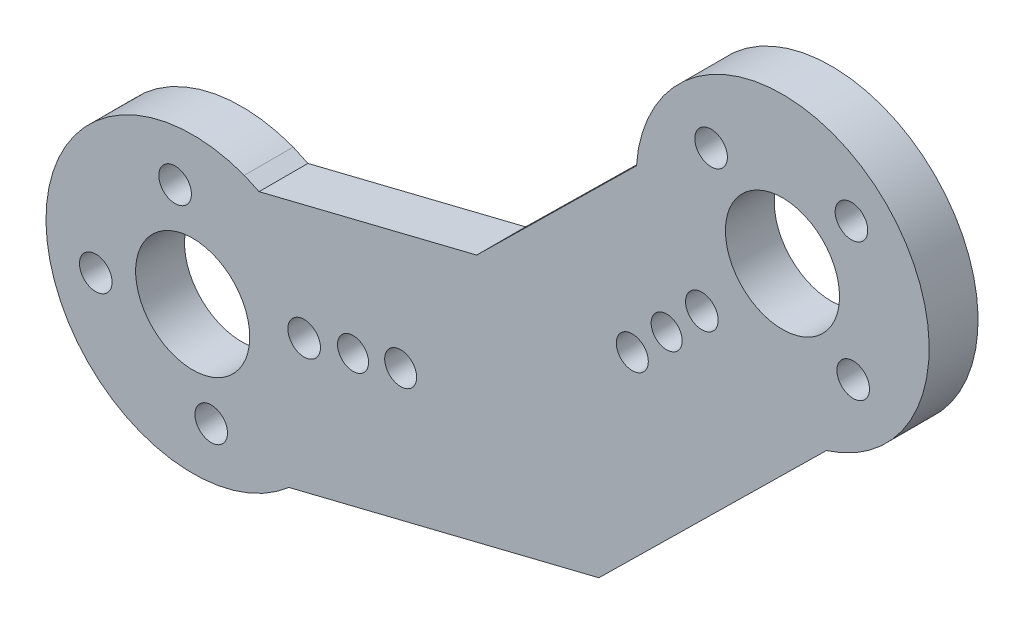
ISO-10303-21;
HEADER;
FILE_DESCRIPTION(('STEP AP214'),'2;1');
FILE_NAME('part.step','',(''),(''),'','','');
FILE_SCHEMA(('AUTOMOTIVE_DESIGN { 1 0 10303 214 1 1 1 1 }'));
ENDSEC;
DATA;
#1=APPLICATION_CONTEXT('core data for automotive mechanical design processes');
#2=APPLICATION_PROTOCOL_DEFINITION('international standard','automotive_design',2000,#1);
#3=PRODUCT_CONTEXT('',#1,'mechanical');
#4=PRODUCT('Part','Part','',(#3));
#5=PRODUCT_RELATED_PRODUCT_CATEGORY('part','',(#4));
#6=PRODUCT_DEFINITION_FORMATION('','',#4);
#7=PRODUCT_DEFINITION_CONTEXT('part definition',#1,'design');
#8=PRODUCT_DEFINITION('design','',#6,#7);
#9=PRODUCT_DEFINITION_SHAPE('','',#8);
#10=(LENGTH_UNIT() NAMED_UNIT(*) SI_UNIT(.MILLI.,.METRE.));
#11=(NAMED_UNIT(*) PLANE_ANGLE_UNIT() SI_UNIT($,.RADIAN.));
#12=(NAMED_UNIT(*) SI_UNIT($,.STERADIAN.) SOLID_ANGLE_UNIT());
#13=UNCERTAINTY_MEASURE_WITH_UNIT(LENGTH_MEASURE(1.E-05),#10,'distance_accuracy_value','');
#14=(GEOMETRIC_REPRESENTATION_CONTEXT(3) GLOBAL_UNCERTAINTY_ASSIGNED_CONTEXT((#13)) GLOBAL_UNIT_ASSIGNED_CONTEXT((#10,
#11,#12)) REPRESENTATION_CONTEXT('',''));
#15=CARTESIAN_POINT('',(0.,0.,0.));
#16=DIRECTION('',(0.,0.,1.));
#17=DIRECTION('',(1.,0.,0.));
#18=AXIS2_PLACEMENT_3D('',#15,#16,#17);
#19=CARTESIAN_POINT('',(-67.5141909041783,8.93081838338803,3.));
#20=DIRECTION('',(0.,0.,1.));
#21=DIRECTION('',(1.,0.,0.));
#22=AXIS2_PLACEMENT_3D('',#19,#20,#21);
#23=PLANE('',#22);
#24=CARTESIAN_POINT('',(-73.4605280592639,7.61583760860506,3.));
#25=DIRECTION('',(0.,0.,1.));
#26=DIRECTION('',(-1.,0.,0.));
#27=AXIS2_PLACEMENT_3D('',#24,#25,#26);
#28=CIRCLE('',#27,0.999999999999994);
#29=CARTESIAN_POINT('',(-74.4605280592638,7.61583760860506,3.));
#30=VERTEX_POINT('',#29);
#31=EDGE_CURVE('E247',#30,#30,#28,.T.);
#32=ORIENTED_EDGE('',*,*,#31,.F.);
#33=EDGE_LOOP('',(#32));
#34=FACE_BOUND('',#33,.T.);
#35=CARTESIAN_POINT('',(-26.9918209162552,25.1757246238808,3.));
#36=DIRECTION('',(0.,0.,1.));
#37=DIRECTION('',(-1.,0.,0.));
#38=AXIS2_PLACEMENT_3D('',#35,#36,#37);
#39=CIRCLE('',#38,0.999999999999997);
#40=CARTESIAN_POINT('',(-27.9918209162552,25.1757246238808,3.));
#41=VERTEX_POINT('',#40);
#42=EDGE_CURVE('E235',#41,#41,#39,.T.);
#43=ORIENTED_EDGE('',*,*,#42,.F.);
#44=EDGE_LOOP('',(#43));
#45=FACE_BOUND('',#44,.T.);
#46=CARTESIAN_POINT('',(-38.4361472781531,21.9913590622129,3.));
#47=DIRECTION('',(0.,0.,1.));
#48=DIRECTION('',(-1.,0.,0.));
#49=AXIS2_PLACEMENT_3D('',#46,#47,#48);
#50=CIRCLE('',#49,0.952573724330306);
#51=CARTESIAN_POINT('',(-39.3887210024834,21.9913590622129,3.));
#52=VERTEX_POINT('',#51);
#53=EDGE_CURVE('E223',#52,#52,#50,.T.);
#54=ORIENTED_EDGE('',*,*,#53,.F.);
#55=EDGE_LOOP('',(#54));
#56=FACE_BOUND('',#55,.T.);
#57=CARTESIAN_POINT('',(-57.6757808668012,11.2277455860194,3.));
#58=DIRECTION('',(0.,0.,1.));
#59=DIRECTION('',(1.,0.,0.));
#60=AXIS2_PLACEMENT_3D('',#57,#58,#59);
#61=CIRCLE('',#60,0.952573724330311);
#62=CARTESIAN_POINT('',(-56.7232071424709,11.2277455860194,3.));
#63=VERTEX_POINT('',#62);
#64=EDGE_CURVE('E211',#63,#63,#61,.T.);
#65=ORIENTED_EDGE('',*,*,#64,.F.);
#66=EDGE_LOOP('',(#65));
#67=FACE_BOUND('',#66,.T.);
#68=CARTESIAN_POINT('',(-40.5435103071916,19.856172638539,3.));
#69=DIRECTION('',(0.,0.,1.));
#70=DIRECTION('',(-1.,0.,0.));
#71=AXIS2_PLACEMENT_3D('',#68,#69,#70);
#72=CIRCLE('',#71,0.980307260569642);
#73=CARTESIAN_POINT('',(-41.5238175677613,19.856172638539,3.));
#74=VERTEX_POINT('',#73);
#75=EDGE_CURVE('E199',#74,#74,#72,.T.);
#76=ORIENTED_EDGE('',*,*,#75,.F.);
#77=EDGE_LOOP('',(#76));
#78=FACE_BOUND('',#77,.T.);
#79=CARTESIAN_POINT('',(-60.6757808668012,10.5359051160979,3.));
#80=DIRECTION('',(0.,0.,1.));
#81=DIRECTION('',(1.,0.,0.));
#82=AXIS2_PLACEMENT_3D('',#79,#80,#81);
#83=CIRCLE('',#82,0.999999999999998);
#84=CARTESIAN_POINT('',(-59.6757808668012,10.5359051160979,3.));
#85=VERTEX_POINT('',#84);
#86=EDGE_CURVE('E187',#85,#85,#83,.T.);
#87=ORIENTED_EDGE('',*,*,#86,.F.);
#88=EDGE_LOOP('',(#87));
#89=FACE_BOUND('',#88,.T.);
#90=CARTESIAN_POINT('',(-27.0988202811822,33.552896145621,3.));
#91=DIRECTION('',(0.,0.,1.));
#92=DIRECTION('',(1.,0.,0.));
#93=AXIS2_PLACEMENT_3D('',#90,#91,#92);
#94=CIRCLE('',#93,1.);
#95=CARTESIAN_POINT('',(-26.0988202811822,33.552896145621,3.));
#96=VERTEX_POINT('',#95);
#97=EDGE_CURVE('E133',#96,#96,#94,.T.);
#98=ORIENTED_EDGE('',*,*,#97,.F.);
#99=EDGE_LOOP('',(#98));
#100=FACE_BOUND('',#99,.T.);
#101=CARTESIAN_POINT('',(-67.5141909041783,8.93081838338803,3.));
#102=DIRECTION('',(0.,0.,1.));
#103=DIRECTION('',(1.,0.,0.));
#104=AXIS2_PLACEMENT_3D('',#101,#102,#103);
#105=CIRCLE('',#104,9.00000000000001);
#106=CARTESIAN_POINT('',(-64.3481560706339,17.355557158732,3.));
#107=VERTEX_POINT('',#106);
#108=CARTESIAN_POINT('',(-61.6083117668075,2.1396040873458,3.));
#109=VERTEX_POINT('',#108);
#110=EDGE_CURVE('E144',#107,#109,#105,.T.);
#111=ORIENTED_EDGE('',*,*,#110,.T.);
#112=DIRECTION('',(0.970680870853682,0.240371893029818,0.));
#113=VECTOR('',#112,1.);
#114=CARTESIAN_POINT('',(-42.594837437472,6.84795361276374,3.));
#115=LINE('',#114,#113);
#116=CARTESIAN_POINT('',(-42.594837437472,6.84795361276374,3.));
#117=VERTEX_POINT('',#116);
#118=EDGE_CURVE('E92',#109,#117,#115,.T.);
#119=ORIENTED_EDGE('',*,*,#118,.T.);
#120=DIRECTION('',(0.71274658117523,0.701421635696406,0.));
#121=VECTOR('',#120,1.);
#122=CARTESIAN_POINT('',(-42.594837437472,6.84795361276374,3.));
#123=LINE('',#122,#121);
#124=CARTESIAN_POINT('',(-28.6337208321983,20.5872397827128,3.));
#125=VERTEX_POINT('',#124);
#126=EDGE_CURVE('E159',#117,#125,#123,.T.);
#127=ORIENTED_EDGE('',*,*,#126,.T.);
#128=CARTESIAN_POINT('',(-31.3308272707553,29.1736020426628,3.));
#129=DIRECTION('',(0.,0.,1.));
#130=DIRECTION('',(-1.,0.,0.));
#131=AXIS2_PLACEMENT_3D('',#128,#129,#130);
#132=CIRCLE('',#131,9.00000000000001);
#133=CARTESIAN_POINT('',(-40.1668475535493,30.8837907930802,3.));
#134=VERTEX_POINT('',#133);
#135=EDGE_CURVE('E172',#125,#134,#132,.T.);
#136=ORIENTED_EDGE('',*,*,#135,.T.);
#137=DIRECTION('',(-0.119606235083846,-0.992821408174233,0.));
#138=VECTOR('',#137,1.);
#139=CARTESIAN_POINT('',(-40.2859437382571,29.8952031853618,3.));
#140=LINE('',#139,#138);
#141=CARTESIAN_POINT('',(-40.2859437382571,29.8952031853618,3.));
#142=VERTEX_POINT('',#141);
#143=EDGE_CURVE('E111',#134,#142,#140,.T.);
#144=ORIENTED_EDGE('',*,*,#143,.T.);
#145=DIRECTION('',(-0.712746581175229,-0.701421635696407,0.));
#146=VECTOR('',#145,1.);
#147=CARTESIAN_POINT('',(-50.0905755280527,20.2463587727237,3.));
#148=LINE('',#147,#146);
#149=CARTESIAN_POINT('',(-50.0905755280527,20.2463587727237,3.));
#150=VERTEX_POINT('',#149);
#151=EDGE_CURVE('E105',#142,#150,#148,.T.);
#152=ORIENTED_EDGE('',*,*,#151,.T.);
#153=DIRECTION('',(-0.970680870853682,-0.240371893029816,0.));
#154=VECTOR('',#153,1.);
#155=CARTESIAN_POINT('',(-50.0905755280527,20.2463587727237,3.));
#156=LINE('',#155,#154);
#157=CARTESIAN_POINT('',(-63.4433839111192,16.9397727209359,3.));
#158=VERTEX_POINT('',#157);
#159=EDGE_CURVE('E109',#150,#158,#156,.T.);
#160=ORIENTED_EDGE('',*,*,#159,.T.);
#161=DIRECTION('',(-0.908647005559174,0.417565107843492,0.));
#162=VECTOR('',#161,1.);
#163=CARTESIAN_POINT('',(-63.4433839111192,16.9397727209359,3.));
#164=LINE('',#163,#162);
#165=EDGE_CURVE('E49',#158,#107,#164,.T.);
#166=ORIENTED_EDGE('',*,*,#165,.T.);
#167=EDGE_LOOP('',(#111,#119,#127,#136,#144,#152,#160,#166));
#168=FACE_BOUND('',#167,.T.);
#169=CARTESIAN_POINT('',(-67.5141909041783,8.93081838338803,3.));
#170=DIRECTION('',(0.,0.,1.));
#171=DIRECTION('',(1.,0.,0.));
#172=AXIS2_PLACEMENT_3D('',#169,#170,#171);
#173=CIRCLE('',#172,3.50000000000001);
#174=CARTESIAN_POINT('',(-64.0141909041783,8.93081838338803,3.));
#175=VERTEX_POINT('',#174);
#176=EDGE_CURVE('E181',#175,#175,#173,.T.);
#177=ORIENTED_EDGE('',*,*,#176,.F.);
#178=EDGE_LOOP('',(#177));
#179=FACE_BOUND('',#178,.T.);
#180=CARTESIAN_POINT('',(-66.3776503958068,3.14132136958529,3.));
#181=DIRECTION('',(0.,0.,1.));
#182=DIRECTION('',(1.,0.,0.));
#183=AXIS2_PLACEMENT_3D('',#180,#181,#182);
#184=CIRCLE('',#183,1.);
#185=CARTESIAN_POINT('',(-65.3776503958068,3.14132136958529,3.));
#186=VERTEX_POINT('',#185);
#187=EDGE_CURVE('E193',#186,#186,#184,.T.);
#188=ORIENTED_EDGE('',*,*,#187,.F.);
#189=EDGE_LOOP('',(#188));
#190=FACE_BOUND('',#189,.T.);
#191=CARTESIAN_POINT('',(-68.5925933302626,14.7314259556528,3.));
#192=DIRECTION('',(0.,0.,1.));
#193=DIRECTION('',(1.,0.,0.));
#194=AXIS2_PLACEMENT_3D('',#191,#192,#193);
#195=CIRCLE('',#194,0.999999999999989);
#196=CARTESIAN_POINT('',(-67.5925933302626,14.7314259556528,3.));
#197=VERTEX_POINT('',#196);
#198=EDGE_CURVE('E205',#197,#197,#195,.T.);
#199=ORIENTED_EDGE('',*,*,#198,.F.);
#200=EDGE_LOOP('',(#199));
#201=FACE_BOUND('',#200,.T.);
#202=CARTESIAN_POINT('',(-54.7535436925875,11.906369117621,3.));
#203=DIRECTION('',(0.,0.,1.));
#204=DIRECTION('',(1.,0.,0.));
#205=AXIS2_PLACEMENT_3D('',#202,#203,#204);
#206=CIRCLE('',#205,0.980307260569642);
#207=CARTESIAN_POINT('',(-53.7732364320179,11.906369117621,3.));
#208=VERTEX_POINT('',#207);
#209=EDGE_CURVE('E217',#208,#208,#206,.T.);
#210=ORIENTED_EDGE('',*,*,#209,.F.);
#211=EDGE_LOOP('',(#210));
#212=FACE_BOUND('',#211,.T.);
#213=CARTESIAN_POINT('',(-35.7097224318492,33.1277488745532,3.));
#214=DIRECTION('',(0.,0.,1.));
#215=DIRECTION('',(-1.,0.,0.));
#216=AXIS2_PLACEMENT_3D('',#213,#214,#215);
#217=CIRCLE('',#216,0.999999999999995);
#218=CARTESIAN_POINT('',(-36.7097224318492,33.1277488745532,3.));
#219=VERTEX_POINT('',#218);
#220=EDGE_CURVE('E229',#219,#219,#217,.T.);
#221=ORIENTED_EDGE('',*,*,#220,.F.);
#222=EDGE_LOOP('',(#221));
#223=FACE_BOUND('',#222,.T.);
#224=CARTESIAN_POINT('',(-36.2768318295127,24.1858977447346,3.));
#225=DIRECTION('',(0.,0.,1.));
#226=DIRECTION('',(-1.,0.,0.));
#227=AXIS2_PLACEMENT_3D('',#224,#225,#226);
#228=CIRCLE('',#227,0.999999999999999);
#229=CARTESIAN_POINT('',(-37.2768318295127,24.1858977447346,3.));
#230=VERTEX_POINT('',#229);
#231=EDGE_CURVE('E241',#230,#230,#228,.T.);
#232=ORIENTED_EDGE('',*,*,#231,.F.);
#233=EDGE_LOOP('',(#232));
#234=FACE_BOUND('',#233,.T.);
#235=CARTESIAN_POINT('',(-31.3308272707553,29.1736020426628,3.));
#236=DIRECTION('',(0.,0.,1.));
#237=DIRECTION('',(-1.,0.,0.));
#238=AXIS2_PLACEMENT_3D('',#235,#236,#237);
#239=CIRCLE('',#238,3.50000000000001);
#240=CARTESIAN_POINT('',(-34.8308272707553,29.1736020426628,3.));
#241=VERTEX_POINT('',#240);
#242=EDGE_CURVE('E253',#241,#241,#239,.T.);
#243=ORIENTED_EDGE('',*,*,#242,.F.);
#244=EDGE_LOOP('',(#243));
#245=FACE_BOUND('',#244,.T.);
#246=ADVANCED_FACE('F32',(#34,#45,#56,#67,#78,#89,#100,#168,#179,#190,#201,#212,#223,#234,#245),
#23,.T.);
#247=CARTESIAN_POINT('',(-67.5141909041783,8.93081838338803,0.));
#248=DIRECTION('',(0.,0.,1.));
#249=DIRECTION('',(1.,0.,0.));
#250=AXIS2_PLACEMENT_3D('',#247,#248,#249);
#251=PLANE('',#250);
#252=CARTESIAN_POINT('',(-73.4605280592639,7.61583760860506,0.));
#253=DIRECTION('',(0.,0.,1.));
#254=DIRECTION('',(-1.,0.,0.));
#255=AXIS2_PLACEMENT_3D('',#252,#253,#254);
#256=CIRCLE('',#255,0.999999999999994);
#257=CARTESIAN_POINT('',(-74.4605280592638,7.61583760860506,0.));
#258=VERTEX_POINT('',#257);
#259=EDGE_CURVE('E250',#258,#258,#256,.T.);
#260=ORIENTED_EDGE('',*,*,#259,.T.);
#261=EDGE_LOOP('',(#260));
#262=FACE_BOUND('',#261,.T.);
#263=CARTESIAN_POINT('',(-26.9918209162552,25.1757246238808,0.));
#264=DIRECTION('',(0.,0.,1.));
#265=DIRECTION('',(-1.,0.,0.));
#266=AXIS2_PLACEMENT_3D('',#263,#264,#265);
#267=CIRCLE('',#266,0.999999999999997);
#268=CARTESIAN_POINT('',(-27.9918209162552,25.1757246238808,0.));
#269=VERTEX_POINT('',#268);
#270=EDGE_CURVE('E238',#269,#269,#267,.T.);
#271=ORIENTED_EDGE('',*,*,#270,.T.);
#272=EDGE_LOOP('',(#271));
#273=FACE_BOUND('',#272,.T.);
#274=CARTESIAN_POINT('',(-38.4361472781531,21.9913590622129,0.));
#275=DIRECTION('',(0.,0.,1.));
#276=DIRECTION('',(-1.,0.,0.));
#277=AXIS2_PLACEMENT_3D('',#274,#275,#276);
#278=CIRCLE('',#277,0.952573724330306);
#279=CARTESIAN_POINT('',(-39.3887210024834,21.9913590622129,0.));
#280=VERTEX_POINT('',#279);
#281=EDGE_CURVE('E226',#280,#280,#278,.T.);
#282=ORIENTED_EDGE('',*,*,#281,.T.);
#283=EDGE_LOOP('',(#282));
#284=FACE_BOUND('',#283,.T.);
#285=CARTESIAN_POINT('',(-57.6757808668012,11.2277455860194,0.));
#286=DIRECTION('',(0.,0.,1.));
#287=DIRECTION('',(1.,0.,0.));
#288=AXIS2_PLACEMENT_3D('',#285,#286,#287);
#289=CIRCLE('',#288,0.952573724330311);
#290=CARTESIAN_POINT('',(-56.7232071424709,11.2277455860194,0.));
#291=VERTEX_POINT('',#290);
#292=EDGE_CURVE('E214',#291,#291,#289,.T.);
#293=ORIENTED_EDGE('',*,*,#292,.T.);
#294=EDGE_LOOP('',(#293));
#295=FACE_BOUND('',#294,.T.);
#296=CARTESIAN_POINT('',(-40.5435103071916,19.856172638539,0.));
#297=DIRECTION('',(0.,0.,1.));
#298=DIRECTION('',(-1.,0.,0.));
#299=AXIS2_PLACEMENT_3D('',#296,#297,#298);
#300=CIRCLE('',#299,0.980307260569642);
#301=CARTESIAN_POINT('',(-41.5238175677613,19.856172638539,0.));
#302=VERTEX_POINT('',#301);
#303=EDGE_CURVE('E202',#302,#302,#300,.T.);
#304=ORIENTED_EDGE('',*,*,#303,.T.);
#305=EDGE_LOOP('',(#304));
#306=FACE_BOUND('',#305,.T.);
#307=CARTESIAN_POINT('',(-60.6757808668012,10.5359051160979,0.));
#308=DIRECTION('',(0.,0.,1.));
#309=DIRECTION('',(1.,0.,0.));
#310=AXIS2_PLACEMENT_3D('',#307,#308,#309);
#311=CIRCLE('',#310,0.999999999999998);
#312=CARTESIAN_POINT('',(-59.6757808668012,10.5359051160979,0.));
#313=VERTEX_POINT('',#312);
#314=EDGE_CURVE('E190',#313,#313,#311,.T.);
#315=ORIENTED_EDGE('',*,*,#314,.T.);
#316=EDGE_LOOP('',(#315));
#317=FACE_BOUND('',#316,.T.);
#318=CARTESIAN_POINT('',(-27.0988202811822,33.552896145621,0.));
#319=DIRECTION('',(0.,0.,1.));
#320=DIRECTION('',(1.,0.,0.));
#321=AXIS2_PLACEMENT_3D('',#318,#319,#320);
#322=CIRCLE('',#321,1.);
#323=CARTESIAN_POINT('',(-26.0988202811822,33.552896145621,0.));
#324=VERTEX_POINT('',#323);
#325=EDGE_CURVE('E178',#324,#324,#322,.T.);
#326=ORIENTED_EDGE('',*,*,#325,.T.);
#327=EDGE_LOOP('',(#326));
#328=FACE_BOUND('',#327,.T.);
#329=CARTESIAN_POINT('',(-67.5141909041783,8.93081838338803,0.));
#330=DIRECTION('',(0.,0.,1.));
#331=DIRECTION('',(1.,0.,0.));
#332=AXIS2_PLACEMENT_3D('',#329,#330,#331);
#333=CIRCLE('',#332,9.00000000000001);
#334=CARTESIAN_POINT('',(-64.3481560706339,17.355557158732,0.));
#335=VERTEX_POINT('',#334);
#336=CARTESIAN_POINT('',(-61.6083117668075,2.1396040873458,0.));
#337=VERTEX_POINT('',#336);
#338=EDGE_CURVE('E129',#335,#337,#333,.T.);
#339=ORIENTED_EDGE('',*,*,#338,.F.);
#340=DIRECTION('',(-0.908647005559174,0.417565107843492,0.));
#341=VECTOR('',#340,1.);
#342=CARTESIAN_POINT('',(-63.4433839111192,16.9397727209359,0.));
#343=LINE('',#342,#341);
#344=CARTESIAN_POINT('',(-63.4433839111192,16.9397727209359,0.));
#345=VERTEX_POINT('',#344);
#346=EDGE_CURVE('E84',#345,#335,#343,.T.);
#347=ORIENTED_EDGE('',*,*,#346,.F.);
#348=DIRECTION('',(-0.970680870853682,-0.240371893029816,0.));
#349=VECTOR('',#348,1.);
#350=CARTESIAN_POINT('',(-50.0905755280527,20.2463587727237,0.));
#351=LINE('',#350,#349);
#352=CARTESIAN_POINT('',(-50.0905755280527,20.2463587727237,0.));
#353=VERTEX_POINT('',#352);
#354=EDGE_CURVE('E78',#353,#345,#351,.T.);
#355=ORIENTED_EDGE('',*,*,#354,.F.);
#356=DIRECTION('',(-0.712746581175229,-0.701421635696407,0.));
#357=VECTOR('',#356,1.);
#358=CARTESIAN_POINT('',(-50.0905755280527,20.2463587727237,0.));
#359=LINE('',#358,#357);
#360=CARTESIAN_POINT('',(-40.2859437382571,29.8952031853618,0.));
#361=VERTEX_POINT('',#360);
#362=EDGE_CURVE('E119',#361,#353,#359,.T.);
#363=ORIENTED_EDGE('',*,*,#362,.F.);
#364=DIRECTION('',(-0.119606235083846,-0.992821408174233,0.));
#365=VECTOR('',#364,1.);
#366=CARTESIAN_POINT('',(-40.2859437382571,29.8952031853618,0.));
#367=LINE('',#366,#365);
#368=CARTESIAN_POINT('',(-40.1668475535493,30.8837907930802,0.));
#369=VERTEX_POINT('',#368);
#370=EDGE_CURVE('E139',#369,#361,#367,.T.);
#371=ORIENTED_EDGE('',*,*,#370,.F.);
#372=CARTESIAN_POINT('',(-31.3308272707553,29.1736020426628,0.));
#373=DIRECTION('',(0.,0.,1.));
#374=DIRECTION('',(-1.,0.,0.));
#375=AXIS2_PLACEMENT_3D('',#372,#373,#374);
#376=CIRCLE('',#375,9.00000000000001);
#377=CARTESIAN_POINT('',(-28.6337208321983,20.5872397827128,0.));
#378=VERTEX_POINT('',#377);
#379=EDGE_CURVE('E137',#378,#369,#376,.T.);
#380=ORIENTED_EDGE('',*,*,#379,.F.);
#381=DIRECTION('',(0.71274658117523,0.701421635696406,0.));
#382=VECTOR('',#381,1.);
#383=CARTESIAN_POINT('',(-42.594837437472,6.84795361276374,0.));
#384=LINE('',#383,#382);
#385=CARTESIAN_POINT('',(-42.594837437472,6.84795361276374,0.));
#386=VERTEX_POINT('',#385);
#387=EDGE_CURVE('E135',#386,#378,#384,.T.);
#388=ORIENTED_EDGE('',*,*,#387,.F.);
#389=DIRECTION('',(0.970680870853682,0.240371893029818,0.));
#390=VECTOR('',#389,1.);
#391=CARTESIAN_POINT('',(-42.594837437472,6.84795361276374,0.));
#392=LINE('',#391,#390);
#393=EDGE_CURVE('E132',#337,#386,#392,.T.);
#394=ORIENTED_EDGE('',*,*,#393,.F.);
#395=EDGE_LOOP('',(#339,#347,#355,#363,#371,#380,#388,#394));
#396=FACE_BOUND('',#395,.T.);
#397=CARTESIAN_POINT('',(-67.5141909041783,8.93081838338803,0.));
#398=DIRECTION('',(0.,0.,1.));
#399=DIRECTION('',(1.,0.,0.));
#400=AXIS2_PLACEMENT_3D('',#397,#398,#399);
#401=CIRCLE('',#400,3.50000000000001);
#402=CARTESIAN_POINT('',(-64.0141909041783,8.93081838338803,0.));
#403=VERTEX_POINT('',#402);
#404=EDGE_CURVE('E184',#403,#403,#401,.T.);
#405=ORIENTED_EDGE('',*,*,#404,.T.);
#406=EDGE_LOOP('',(#405));
#407=FACE_BOUND('',#406,.T.);
#408=CARTESIAN_POINT('',(-66.3776503958068,3.14132136958529,0.));
#409=DIRECTION('',(0.,0.,1.));
#410=DIRECTION('',(1.,0.,0.));
#411=AXIS2_PLACEMENT_3D('',#408,#409,#410);
#412=CIRCLE('',#411,1.);
#413=CARTESIAN_POINT('',(-65.3776503958068,3.14132136958529,0.));
#414=VERTEX_POINT('',#413);
#415=EDGE_CURVE('E196',#414,#414,#412,.T.);
#416=ORIENTED_EDGE('',*,*,#415,.T.);
#417=EDGE_LOOP('',(#416));
#418=FACE_BOUND('',#417,.T.);
#419=CARTESIAN_POINT('',(-68.5925933302626,14.7314259556528,0.));
#420=DIRECTION('',(0.,0.,1.));
#421=DIRECTION('',(1.,0.,0.));
#422=AXIS2_PLACEMENT_3D('',#419,#420,#421);
#423=CIRCLE('',#422,0.999999999999989);
#424=CARTESIAN_POINT('',(-67.5925933302626,14.7314259556528,0.));
#425=VERTEX_POINT('',#424);
#426=EDGE_CURVE('E208',#425,#425,#423,.T.);
#427=ORIENTED_EDGE('',*,*,#426,.T.);
#428=EDGE_LOOP('',(#427));
#429=FACE_BOUND('',#428,.T.);
#430=CARTESIAN_POINT('',(-54.7535436925875,11.906369117621,0.));
#431=DIRECTION('',(0.,0.,1.));
#432=DIRECTION('',(1.,0.,0.));
#433=AXIS2_PLACEMENT_3D('',#430,#431,#432);
#434=CIRCLE('',#433,0.980307260569642);
#435=CARTESIAN_POINT('',(-53.7732364320179,11.906369117621,0.));
#436=VERTEX_POINT('',#435);
#437=EDGE_CURVE('E220',#436,#436,#434,.T.);
#438=ORIENTED_EDGE('',*,*,#437,.T.);
#439=EDGE_LOOP('',(#438));
#440=FACE_BOUND('',#439,.T.);
#441=CARTESIAN_POINT('',(-35.7097224318492,33.1277488745532,0.));
#442=DIRECTION('',(0.,0.,1.));
#443=DIRECTION('',(-1.,0.,0.));
#444=AXIS2_PLACEMENT_3D('',#441,#442,#443);
#445=CIRCLE('',#444,0.999999999999995);
#446=CARTESIAN_POINT('',(-36.7097224318492,33.1277488745532,0.));
#447=VERTEX_POINT('',#446);
#448=EDGE_CURVE('E232',#447,#447,#445,.T.);
#449=ORIENTED_EDGE('',*,*,#448,.T.);
#450=EDGE_LOOP('',(#449));
#451=FACE_BOUND('',#450,.T.);
#452=CARTESIAN_POINT('',(-36.2768318295127,24.1858977447346,0.));
#453=DIRECTION('',(0.,0.,1.));
#454=DIRECTION('',(-1.,0.,0.));
#455=AXIS2_PLACEMENT_3D('',#452,#453,#454);
#456=CIRCLE('',#455,0.999999999999999);
#457=CARTESIAN_POINT('',(-37.2768318295127,24.1858977447346,0.));
#458=VERTEX_POINT('',#457);
#459=EDGE_CURVE('E244',#458,#458,#456,.T.);
#460=ORIENTED_EDGE('',*,*,#459,.T.);
#461=EDGE_LOOP('',(#460));
#462=FACE_BOUND('',#461,.T.);
#463=CARTESIAN_POINT('',(-31.3308272707553,29.1736020426628,0.));
#464=DIRECTION('',(0.,0.,1.));
#465=DIRECTION('',(-1.,0.,0.));
#466=AXIS2_PLACEMENT_3D('',#463,#464,#465);
#467=CIRCLE('',#466,3.50000000000001);
#468=CARTESIAN_POINT('',(-34.8308272707553,29.1736020426628,0.));
#469=VERTEX_POINT('',#468);
#470=EDGE_CURVE('E256',#469,#469,#467,.T.);
#471=ORIENTED_EDGE('',*,*,#470,.T.);
#472=EDGE_LOOP('',(#471));
#473=FACE_BOUND('',#472,.T.);
#474=ADVANCED_FACE('F163',(#262,#273,#284,#295,#306,#317,#328,#396,#407,#418,#429,#440,#451,
#462,#473),#251,.F.);
#475=CARTESIAN_POINT('',(-67.5141909041783,8.93081838338803,3.));
#476=DIRECTION('',(0.,0.,-1.));
#477=DIRECTION('',(-1.,0.,0.));
#478=AXIS2_PLACEMENT_3D('',#475,#476,#477);
#479=CYLINDRICAL_SURFACE('',#478,9.00000000000001);
#480=ORIENTED_EDGE('',*,*,#338,.T.);
#481=DIRECTION('',(0.,0.,-1.));
#482=VECTOR('',#481,1.);
#483=CARTESIAN_POINT('',(-61.6083117668075,2.1396040873458,3.));
#484=LINE('',#483,#482);
#485=EDGE_CURVE('E11',#109,#337,#484,.T.);
#486=ORIENTED_EDGE('',*,*,#485,.F.);
#487=ORIENTED_EDGE('',*,*,#110,.F.);
#488=DIRECTION('',(0.,0.,-1.));
#489=VECTOR('',#488,1.);
#490=CARTESIAN_POINT('',(-64.3481560706339,17.355557158732,3.));
#491=LINE('',#490,#489);
#492=EDGE_CURVE('E125',#107,#335,#491,.T.);
#493=ORIENTED_EDGE('',*,*,#492,.T.);
#494=EDGE_LOOP('',(#480,#486,#487,#493));
#495=FACE_BOUND('',#494,.T.);
#496=ADVANCED_FACE('F34',(#495),#479,.T.);
#497=CARTESIAN_POINT('',(-42.594837437472,6.84795361276374,3.));
#498=DIRECTION('',(-0.240371893029818,0.970680870853682,0.));
#499=DIRECTION('',(-0.970680870853682,-0.240371893029818,0.));
#500=AXIS2_PLACEMENT_3D('',#497,#498,#499);
#501=PLANE('',#500);
#502=ORIENTED_EDGE('',*,*,#393,.T.);
#503=DIRECTION('',(0.,0.,-1.));
#504=VECTOR('',#503,1.);
#505=CARTESIAN_POINT('',(-42.594837437472,6.84795361276374,3.));
#506=LINE('',#505,#504);
#507=EDGE_CURVE('E41',#117,#386,#506,.T.);
#508=ORIENTED_EDGE('',*,*,#507,.F.);
#509=ORIENTED_EDGE('',*,*,#118,.F.);
#510=ORIENTED_EDGE('',*,*,#485,.T.);
#511=EDGE_LOOP('',(#502,#508,#509,#510));
#512=FACE_BOUND('',#511,.T.);
#513=ADVANCED_FACE('F291',(#512),#501,.F.);
#514=CARTESIAN_POINT('',(-42.594837437472,6.84795361276374,3.));
#515=DIRECTION('',(-0.701421635696406,0.71274658117523,0.));
#516=DIRECTION('',(-0.71274658117523,-0.701421635696406,0.));
#517=AXIS2_PLACEMENT_3D('',#514,#515,#516);
#518=PLANE('',#517);
#519=ORIENTED_EDGE('',*,*,#387,.T.);
#520=DIRECTION('',(0.,0.,-1.));
#521=VECTOR('',#520,1.);
#522=CARTESIAN_POINT('',(-28.6337208321983,20.5872397827128,3.));
#523=LINE('',#522,#521);
#524=EDGE_CURVE('E151',#125,#378,#523,.T.);
#525=ORIENTED_EDGE('',*,*,#524,.F.);
#526=ORIENTED_EDGE('',*,*,#126,.F.);
#527=ORIENTED_EDGE('',*,*,#507,.T.);
#528=EDGE_LOOP('',(#519,#525,#526,#527));
#529=FACE_BOUND('',#528,.T.);
#530=ADVANCED_FACE('F157',(#529),#518,.F.);
#531=CARTESIAN_POINT('',(-31.3308272707553,29.1736020426628,3.));
#532=DIRECTION('',(0.,0.,-1.));
#533=DIRECTION('',(-1.,0.,0.));
#534=AXIS2_PLACEMENT_3D('',#531,#532,#533);
#535=CYLINDRICAL_SURFACE('',#534,9.00000000000001);
#536=ORIENTED_EDGE('',*,*,#379,.T.);
#537=DIRECTION('',(0.,0.,-1.));
#538=VECTOR('',#537,1.);
#539=CARTESIAN_POINT('',(-40.1668475535493,30.8837907930802,3.));
#540=LINE('',#539,#538);
#541=EDGE_CURVE('E148',#134,#369,#540,.T.);
#542=ORIENTED_EDGE('',*,*,#541,.F.);
#543=ORIENTED_EDGE('',*,*,#135,.F.);
#544=ORIENTED_EDGE('',*,*,#524,.T.);
#545=EDGE_LOOP('',(#536,#542,#543,#544));
#546=FACE_BOUND('',#545,.T.);
#547=ADVANCED_FACE('F168',(#546),#535,.T.);
#548=CARTESIAN_POINT('',(-40.2859437382571,29.8952031853618,3.));
#549=DIRECTION('',(0.992821408174233,-0.119606235083846,0.));
#550=DIRECTION('',(0.119606235083846,0.992821408174233,0.));
#551=AXIS2_PLACEMENT_3D('',#548,#549,#550);
#552=PLANE('',#551);
#553=ORIENTED_EDGE('',*,*,#370,.T.);
#554=DIRECTION('',(0.,0.,-1.));
#555=VECTOR('',#554,1.);
#556=CARTESIAN_POINT('',(-40.2859437382571,29.8952031853618,3.));
#557=LINE('',#556,#555);
#558=EDGE_CURVE('E120',#142,#361,#557,.T.);
#559=ORIENTED_EDGE('',*,*,#558,.F.);
#560=ORIENTED_EDGE('',*,*,#143,.F.);
#561=ORIENTED_EDGE('',*,*,#541,.T.);
#562=EDGE_LOOP('',(#553,#559,#560,#561));
#563=FACE_BOUND('',#562,.T.);
#564=ADVANCED_FACE('F171',(#563),#552,.F.);
#565=CARTESIAN_POINT('',(-50.0905755280527,20.2463587727237,3.));
#566=DIRECTION('',(0.701421635696406,-0.712746581175229,0.));
#567=DIRECTION('',(0.712746581175229,0.701421635696407,0.));
#568=AXIS2_PLACEMENT_3D('',#565,#566,#567);
#569=PLANE('',#568);
#570=ORIENTED_EDGE('',*,*,#362,.T.);
#571=DIRECTION('',(0.,0.,-1.));
#572=VECTOR('',#571,1.);
#573=CARTESIAN_POINT('',(-50.0905755280527,20.2463587727237,3.));
#574=LINE('',#573,#572);
#575=EDGE_CURVE('E116',#150,#353,#574,.T.);
#576=ORIENTED_EDGE('',*,*,#575,.F.);
#577=ORIENTED_EDGE('',*,*,#151,.F.);
#578=ORIENTED_EDGE('',*,*,#558,.T.);
#579=EDGE_LOOP('',(#570,#576,#577,#578));
#580=FACE_BOUND('',#579,.T.);
#581=ADVANCED_FACE('F117',(#580),#569,.F.);
#582=CARTESIAN_POINT('',(-50.0905755280527,20.2463587727237,3.));
#583=DIRECTION('',(0.240371893029816,-0.970680870853682,0.));
#584=DIRECTION('',(0.970680870853682,0.240371893029816,0.));
#585=AXIS2_PLACEMENT_3D('',#582,#583,#584);
#586=PLANE('',#585);
#587=ORIENTED_EDGE('',*,*,#354,.T.);
#588=DIRECTION('',(0.,0.,-1.));
#589=VECTOR('',#588,1.);
#590=CARTESIAN_POINT('',(-63.4433839111192,16.9397727209359,3.));
#591=LINE('',#590,#589);
#592=EDGE_CURVE('E121',#158,#345,#591,.T.);
#593=ORIENTED_EDGE('',*,*,#592,.F.);
#594=ORIENTED_EDGE('',*,*,#159,.F.);
#595=ORIENTED_EDGE('',*,*,#575,.T.);
#596=EDGE_LOOP('',(#587,#593,#594,#595));
#597=FACE_BOUND('',#596,.T.);
#598=ADVANCED_FACE('F123',(#597),#586,.F.);
#599=CARTESIAN_POINT('',(-63.4433839111192,16.9397727209359,3.));
#600=DIRECTION('',(-0.417565107843492,-0.908647005559174,0.));
#601=DIRECTION('',(0.908647005559174,-0.417565107843492,0.));
#602=AXIS2_PLACEMENT_3D('',#599,#600,#601);
#603=PLANE('',#602);
#604=ORIENTED_EDGE('',*,*,#346,.T.);
#605=ORIENTED_EDGE('',*,*,#492,.F.);
#606=ORIENTED_EDGE('',*,*,#165,.F.);
#607=ORIENTED_EDGE('',*,*,#592,.T.);
#608=EDGE_LOOP('',(#604,#605,#606,#607));
#609=FACE_BOUND('',#608,.T.);
#610=ADVANCED_FACE('F279',(#609),#603,.F.);
#611=CARTESIAN_POINT('',(-27.0988202811822,33.552896145621,3.));
#612=DIRECTION('',(0.,0.,-1.));
#613=DIRECTION('',(-1.,0.,0.));
#614=AXIS2_PLACEMENT_3D('',#611,#612,#613);
#615=CYLINDRICAL_SURFACE('',#614,1.);
#616=ORIENTED_EDGE('',*,*,#97,.T.);
#617=EDGE_LOOP('',(#616));
#618=FACE_BOUND('',#617,.T.);
#619=ORIENTED_EDGE('',*,*,#325,.F.);
#620=EDGE_LOOP('',(#619));
#621=FACE_BOUND('',#620,.T.);
#622=ADVANCED_FACE('F276',(#618,#621),#615,.F.);
#623=CARTESIAN_POINT('',(-67.5141909041783,8.93081838338803,3.));
#624=DIRECTION('',(0.,0.,-1.));
#625=DIRECTION('',(-1.,0.,0.));
#626=AXIS2_PLACEMENT_3D('',#623,#624,#625);
#627=CYLINDRICAL_SURFACE('',#626,3.50000000000001);
#628=ORIENTED_EDGE('',*,*,#176,.T.);
#629=EDGE_LOOP('',(#628));
#630=FACE_BOUND('',#629,.T.);
#631=ORIENTED_EDGE('',*,*,#404,.F.);
#632=EDGE_LOOP('',(#631));
#633=FACE_BOUND('',#632,.T.);
#634=ADVANCED_FACE('F355',(#630,#633),#627,.F.);
#635=CARTESIAN_POINT('',(-60.6757808668012,10.5359051160979,3.));
#636=DIRECTION('',(0.,0.,-1.));
#637=DIRECTION('',(-1.,0.,0.));
#638=AXIS2_PLACEMENT_3D('',#635,#636,#637);
#639=CYLINDRICAL_SURFACE('',#638,0.999999999999998);
#640=ORIENTED_EDGE('',*,*,#86,.T.);
#641=EDGE_LOOP('',(#640));
#642=FACE_BOUND('',#641,.T.);
#643=ORIENTED_EDGE('',*,*,#314,.F.);
#644=EDGE_LOOP('',(#643));
#645=FACE_BOUND('',#644,.T.);
#646=ADVANCED_FACE('F363',(#642,#645),#639,.F.);
#647=CARTESIAN_POINT('',(-66.3776503958068,3.14132136958529,3.));
#648=DIRECTION('',(0.,0.,-1.));
#649=DIRECTION('',(-1.,0.,0.));
#650=AXIS2_PLACEMENT_3D('',#647,#648,#649);
#651=CYLINDRICAL_SURFACE('',#650,1.);
#652=ORIENTED_EDGE('',*,*,#187,.T.);
#653=EDGE_LOOP('',(#652));
#654=FACE_BOUND('',#653,.T.);
#655=ORIENTED_EDGE('',*,*,#415,.F.);
#656=EDGE_LOOP('',(#655));
#657=FACE_BOUND('',#656,.T.);
#658=ADVANCED_FACE('F371',(#654,#657),#651,.F.);
#659=CARTESIAN_POINT('',(-40.5435103071916,19.856172638539,3.));
#660=DIRECTION('',(0.,0.,-1.));
#661=DIRECTION('',(-1.,0.,0.));
#662=AXIS2_PLACEMENT_3D('',#659,#660,#661);
#663=CYLINDRICAL_SURFACE('',#662,0.980307260569642);
#664=ORIENTED_EDGE('',*,*,#75,.T.);
#665=EDGE_LOOP('',(#664));
#666=FACE_BOUND('',#665,.T.);
#667=ORIENTED_EDGE('',*,*,#303,.F.);
#668=EDGE_LOOP('',(#667));
#669=FACE_BOUND('',#668,.T.);
#670=ADVANCED_FACE('F380',(#666,#669),#663,.F.);
#671=CARTESIAN_POINT('',(-68.5925933302626,14.7314259556528,3.));
#672=DIRECTION('',(0.,0.,-1.));
#673=DIRECTION('',(-1.,0.,0.));
#674=AXIS2_PLACEMENT_3D('',#671,#672,#673);
#675=CYLINDRICAL_SURFACE('',#674,0.999999999999989);
#676=ORIENTED_EDGE('',*,*,#198,.T.);
#677=EDGE_LOOP('',(#676));
#678=FACE_BOUND('',#677,.T.);
#679=ORIENTED_EDGE('',*,*,#426,.F.);
#680=EDGE_LOOP('',(#679));
#681=FACE_BOUND('',#680,.T.);
#682=ADVANCED_FACE('F389',(#678,#681),#675,.F.);
#683=CARTESIAN_POINT('',(-57.6757808668012,11.2277455860194,3.));
#684=DIRECTION('',(0.,0.,-1.));
#685=DIRECTION('',(-1.,0.,0.));
#686=AXIS2_PLACEMENT_3D('',#683,#684,#685);
#687=CYLINDRICAL_SURFACE('',#686,0.952573724330311);
#688=ORIENTED_EDGE('',*,*,#64,.T.);
#689=EDGE_LOOP('',(#688));
#690=FACE_BOUND('',#689,.T.);
#691=ORIENTED_EDGE('',*,*,#292,.F.);
#692=EDGE_LOOP('',(#691));
#693=FACE_BOUND('',#692,.T.);
#694=ADVANCED_FACE('F398',(#690,#693),#687,.F.);
#695=CARTESIAN_POINT('',(-54.7535436925875,11.906369117621,3.));
#696=DIRECTION('',(0.,0.,-1.));
#697=DIRECTION('',(-1.,0.,0.));
#698=AXIS2_PLACEMENT_3D('',#695,#696,#697);
#699=CYLINDRICAL_SURFACE('',#698,0.980307260569642);
#700=ORIENTED_EDGE('',*,*,#209,.T.);
#701=EDGE_LOOP('',(#700));
#702=FACE_BOUND('',#701,.T.);
#703=ORIENTED_EDGE('',*,*,#437,.F.);
#704=EDGE_LOOP('',(#703));
#705=FACE_BOUND('',#704,.T.);
#706=ADVANCED_FACE('F407',(#702,#705),#699,.F.);
#707=CARTESIAN_POINT('',(-38.4361472781531,21.9913590622129,3.));
#708=DIRECTION('',(0.,0.,-1.));
#709=DIRECTION('',(-1.,0.,0.));
#710=AXIS2_PLACEMENT_3D('',#707,#708,#709);
#711=CYLINDRICAL_SURFACE('',#710,0.952573724330306);
#712=ORIENTED_EDGE('',*,*,#53,.T.);
#713=EDGE_LOOP('',(#712));
#714=FACE_BOUND('',#713,.T.);
#715=ORIENTED_EDGE('',*,*,#281,.F.);
#716=EDGE_LOOP('',(#715));
#717=FACE_BOUND('',#716,.T.);
#718=ADVANCED_FACE('F416',(#714,#717),#711,.F.);
#719=CARTESIAN_POINT('',(-35.7097224318492,33.1277488745532,3.));
#720=DIRECTION('',(0.,0.,-1.));
#721=DIRECTION('',(-1.,0.,0.));
#722=AXIS2_PLACEMENT_3D('',#719,#720,#721);
#723=CYLINDRICAL_SURFACE('',#722,0.999999999999995);
#724=ORIENTED_EDGE('',*,*,#220,.T.);
#725=EDGE_LOOP('',(#724));
#726=FACE_BOUND('',#725,.T.);
#727=ORIENTED_EDGE('',*,*,#448,.F.);
#728=EDGE_LOOP('',(#727));
#729=FACE_BOUND('',#728,.T.);
#730=ADVANCED_FACE('F425',(#726,#729),#723,.F.);
#731=CARTESIAN_POINT('',(-26.9918209162552,25.1757246238808,3.));
#732=DIRECTION('',(0.,0.,-1.));
#733=DIRECTION('',(-1.,0.,0.));
#734=AXIS2_PLACEMENT_3D('',#731,#732,#733);
#735=CYLINDRICAL_SURFACE('',#734,0.999999999999997);
#736=ORIENTED_EDGE('',*,*,#42,.T.);
#737=EDGE_LOOP('',(#736));
#738=FACE_BOUND('',#737,.T.);
#739=ORIENTED_EDGE('',*,*,#270,.F.);
#740=EDGE_LOOP('',(#739));
#741=FACE_BOUND('',#740,.T.);
#742=ADVANCED_FACE('F434',(#738,#741),#735,.F.);
#743=CARTESIAN_POINT('',(-36.2768318295127,24.1858977447346,3.));
#744=DIRECTION('',(0.,0.,-1.));
#745=DIRECTION('',(-1.,0.,0.));
#746=AXIS2_PLACEMENT_3D('',#743,#744,#745);
#747=CYLINDRICAL_SURFACE('',#746,0.999999999999999);
#748=ORIENTED_EDGE('',*,*,#231,.T.);
#749=EDGE_LOOP('',(#748));
#750=FACE_BOUND('',#749,.T.);
#751=ORIENTED_EDGE('',*,*,#459,.F.);
#752=EDGE_LOOP('',(#751));
#753=FACE_BOUND('',#752,.T.);
#754=ADVANCED_FACE('F443',(#750,#753),#747,.F.);
#755=CARTESIAN_POINT('',(-73.4605280592639,7.61583760860506,3.));
#756=DIRECTION('',(0.,0.,-1.));
#757=DIRECTION('',(-1.,0.,0.));
#758=AXIS2_PLACEMENT_3D('',#755,#756,#757);
#759=CYLINDRICAL_SURFACE('',#758,0.999999999999994);
#760=ORIENTED_EDGE('',*,*,#31,.T.);
#761=EDGE_LOOP('',(#760));
#762=FACE_BOUND('',#761,.T.);
#763=ORIENTED_EDGE('',*,*,#259,.F.);
#764=EDGE_LOOP('',(#763));
#765=FACE_BOUND('',#764,.T.);
#766=ADVANCED_FACE('F452',(#762,#765),#759,.F.);
#767=CARTESIAN_POINT('',(-31.3308272707553,29.1736020426628,3.));
#768=DIRECTION('',(0.,0.,-1.));
#769=DIRECTION('',(-1.,0.,0.));
#770=AXIS2_PLACEMENT_3D('',#767,#768,#769);
#771=CYLINDRICAL_SURFACE('',#770,3.50000000000001);
#772=ORIENTED_EDGE('',*,*,#242,.T.);
#773=EDGE_LOOP('',(#772));
#774=FACE_BOUND('',#773,.T.);
#775=ORIENTED_EDGE('',*,*,#470,.F.);
#776=EDGE_LOOP('',(#775));
#777=FACE_BOUND('',#776,.T.);
#778=ADVANCED_FACE('F262',(#774,#777),#771,.F.);
#779=CLOSED_SHELL('',(#246,#474,#496,#513,#530,#547,#564,#581,#598,#610,#622,#634,#646,#658,
#670,#682,#694,#706,#718,#730,#742,#754,#766,#778));
#780=MANIFOLD_SOLID_BREP('B2',#779);
#781=ADVANCED_BREP_SHAPE_REPRESENTATION('',(#18,#780),#14);
#782=SHAPE_DEFINITION_REPRESENTATION(#9,#781);
ENDSEC;
END-ISO-10303-21;
